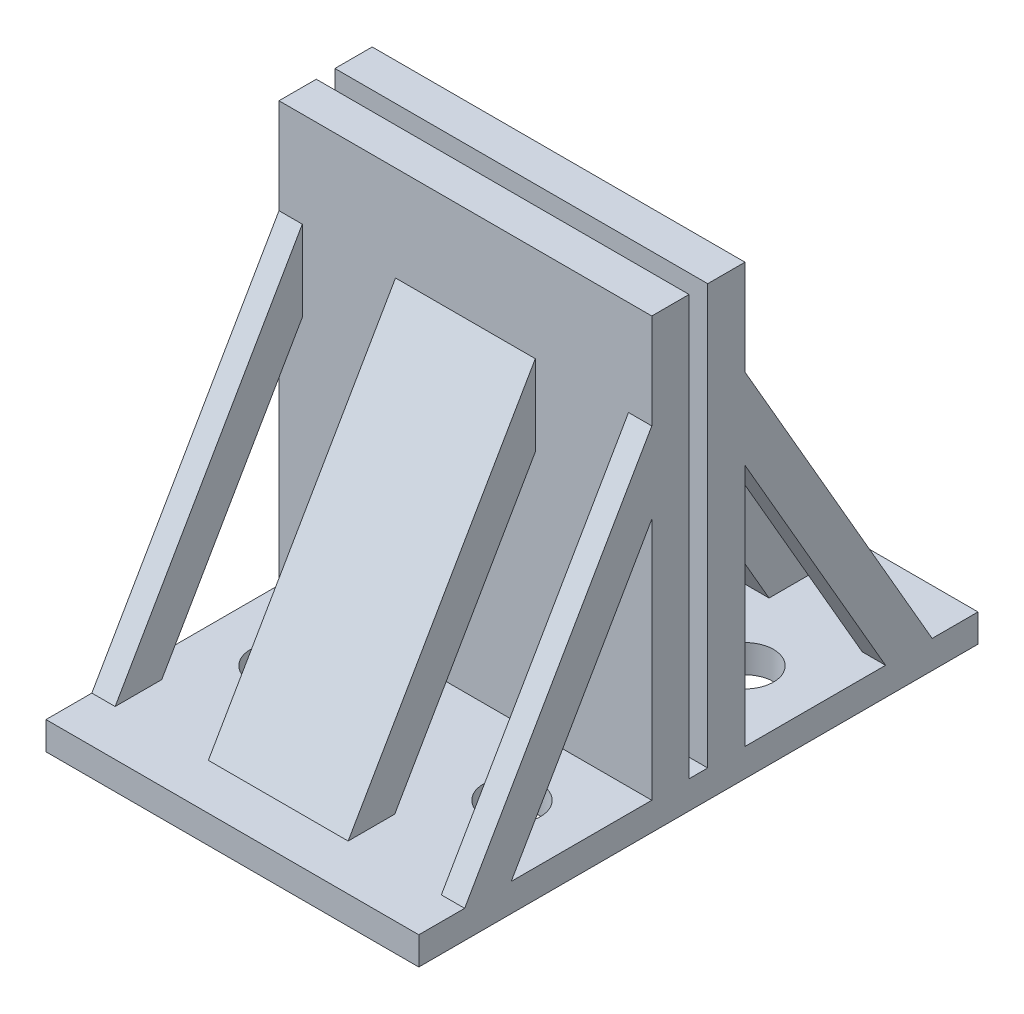
ISO-10303-21;
HEADER;
FILE_DESCRIPTION(('STEP AP214'),'2;1');
FILE_NAME('part.step','',(''),(''),'','','');
FILE_SCHEMA(('AUTOMOTIVE_DESIGN { 1 0 10303 214 1 1 1 1 }'));
ENDSEC;
DATA;
#1=APPLICATION_CONTEXT('core data for automotive mechanical design processes');
#2=APPLICATION_PROTOCOL_DEFINITION('international standard','automotive_design',2000,#1);
#3=PRODUCT_CONTEXT('',#1,'mechanical');
#4=PRODUCT('Part','Part','',(#3));
#5=PRODUCT_RELATED_PRODUCT_CATEGORY('part','',(#4));
#6=PRODUCT_DEFINITION_FORMATION('','',#4);
#7=PRODUCT_DEFINITION_CONTEXT('part definition',#1,'design');
#8=PRODUCT_DEFINITION('design','',#6,#7);
#9=PRODUCT_DEFINITION_SHAPE('','',#8);
#10=(LENGTH_UNIT() NAMED_UNIT(*) SI_UNIT(.MILLI.,.METRE.));
#11=(NAMED_UNIT(*) PLANE_ANGLE_UNIT() SI_UNIT($,.RADIAN.));
#12=(NAMED_UNIT(*) SI_UNIT($,.STERADIAN.) SOLID_ANGLE_UNIT());
#13=UNCERTAINTY_MEASURE_WITH_UNIT(LENGTH_MEASURE(1.E-05),#10,'distance_accuracy_value','');
#14=(GEOMETRIC_REPRESENTATION_CONTEXT(3) GLOBAL_UNCERTAINTY_ASSIGNED_CONTEXT((#13)) GLOBAL_UNIT_ASSIGNED_CONTEXT((#10,
#11,#12)) REPRESENTATION_CONTEXT('',''));
#15=CARTESIAN_POINT('',(0.,0.,0.));
#16=DIRECTION('',(0.,0.,1.));
#17=DIRECTION('',(1.,0.,0.));
#18=AXIS2_PLACEMENT_3D('',#15,#16,#17);
#19=CARTESIAN_POINT('',(20.,3.,25.0811714558439));
#20=DIRECTION('',(0.,-0.500000000000004,-0.866025403784437));
#21=DIRECTION('',(0.,0.866025403784437,-0.500000000000004));
#22=AXIS2_PLACEMENT_3D('',#19,#20,#21);
#23=PLANE('',#22);
#24=DIRECTION('',(0.,-0.866025403784437,0.500000000000004));
#25=VECTOR('',#24,1.);
#26=CARTESIAN_POINT('',(-17.5,3.,25.0811714558439));
#27=LINE('',#26,#25);
#28=CARTESIAN_POINT('',(-17.5,37.7816092370232,4.99999999999998));
#29=VERTEX_POINT('',#28);
#30=CARTESIAN_POINT('',(-17.5,3.,25.0811714558439));
#31=VERTEX_POINT('',#30);
#32=EDGE_CURVE('E289',#29,#31,#27,.T.);
#33=ORIENTED_EDGE('',*,*,#32,.F.);
#34=DIRECTION('',(-1.,0.,0.));
#35=VECTOR('',#34,1.);
#36=CARTESIAN_POINT('',(20.,37.7816092370231,5.));
#37=LINE('',#36,#35);
#38=CARTESIAN_POINT('',(-20.,37.7816092370231,5.));
#39=VERTEX_POINT('',#38);
#40=EDGE_CURVE('E296',#29,#39,#37,.T.);
#41=ORIENTED_EDGE('',*,*,#40,.T.);
#42=DIRECTION('',(0.,-0.866025403784436,0.500000000000004));
#43=VECTOR('',#42,1.);
#44=CARTESIAN_POINT('',(-20.,3.,25.0811714558439));
#45=LINE('',#44,#43);
#46=CARTESIAN_POINT('',(-20.,3.,25.0811714558439));
#47=VERTEX_POINT('',#46);
#48=EDGE_CURVE('E542',#39,#47,#45,.T.);
#49=ORIENTED_EDGE('',*,*,#48,.T.);
#50=DIRECTION('',(-1.,0.,0.));
#51=VECTOR('',#50,1.);
#52=CARTESIAN_POINT('',(20.,3.,25.0811714558439));
#53=LINE('',#52,#51);
#54=EDGE_CURVE('E293',#31,#47,#53,.T.);
#55=ORIENTED_EDGE('',*,*,#54,.F.);
#56=EDGE_LOOP('',(#33,#41,#49,#55));
#57=FACE_BOUND('',#56,.T.);
#58=ADVANCED_FACE('F39',(#57),#23,.F.);
#59=CARTESIAN_POINT('',(7.5,37.7816092370232,4.99999999999998));
#60=VERTEX_POINT('',#59);
#61=CARTESIAN_POINT('',(-7.5,37.7816092370231,5.));
#62=VERTEX_POINT('',#61);
#63=EDGE_CURVE('E287',#60,#62,#37,.T.);
#64=ORIENTED_EDGE('',*,*,#63,.T.);
#65=DIRECTION('',(0.,-0.866025403784437,0.500000000000004));
#66=VECTOR('',#65,1.);
#67=CARTESIAN_POINT('',(-7.5,3.,25.0811714558439));
#68=LINE('',#67,#66);
#69=CARTESIAN_POINT('',(-7.5,3.,25.0811714558439));
#70=VERTEX_POINT('',#69);
#71=EDGE_CURVE('E275',#62,#70,#68,.T.);
#72=ORIENTED_EDGE('',*,*,#71,.T.);
#73=CARTESIAN_POINT('',(7.5,3.,25.0811714558439));
#74=VERTEX_POINT('',#73);
#75=EDGE_CURVE('E285',#74,#70,#53,.T.);
#76=ORIENTED_EDGE('',*,*,#75,.F.);
#77=DIRECTION('',(0.,-0.866025403784437,0.500000000000004));
#78=VECTOR('',#77,1.);
#79=CARTESIAN_POINT('',(7.5,3.,25.0811714558439));
#80=LINE('',#79,#78);
#81=EDGE_CURVE('E570',#60,#74,#80,.T.);
#82=ORIENTED_EDGE('',*,*,#81,.F.);
#83=EDGE_LOOP('',(#64,#72,#76,#82));
#84=FACE_BOUND('',#83,.T.);
#85=ADVANCED_FACE('F283',(#84),#23,.F.);
#86=CARTESIAN_POINT('',(20.,29.1213551991788,5.));
#87=DIRECTION('',(0.,0.500000000000004,0.866025403784436));
#88=DIRECTION('',(0.,-0.866025403784436,0.500000000000004));
#89=AXIS2_PLACEMENT_3D('',#86,#87,#88);
#90=PLANE('',#89);
#91=DIRECTION('',(0.,0.866025403784436,-0.500000000000004));
#92=VECTOR('',#91,1.);
#93=CARTESIAN_POINT('',(-17.5,29.1213551991788,4.99999999999999));
#94=LINE('',#93,#92);
#95=CARTESIAN_POINT('',(-17.5,3.,20.0811714558439));
#96=VERTEX_POINT('',#95);
#97=CARTESIAN_POINT('',(-17.5,29.1213551991788,4.99999999999999));
#98=VERTEX_POINT('',#97);
#99=EDGE_CURVE('E47',#96,#98,#94,.T.);
#100=ORIENTED_EDGE('',*,*,#99,.F.);
#101=DIRECTION('',(-1.,0.,0.));
#102=VECTOR('',#101,1.);
#103=CARTESIAN_POINT('',(20.,3.,20.0811714558439));
#104=LINE('',#103,#102);
#105=CARTESIAN_POINT('',(-20.,3.,20.0811714558439));
#106=VERTEX_POINT('',#105);
#107=EDGE_CURVE('E461',#96,#106,#104,.T.);
#108=ORIENTED_EDGE('',*,*,#107,.T.);
#109=DIRECTION('',(0.,0.866025403784436,-0.500000000000004));
#110=VECTOR('',#109,1.);
#111=CARTESIAN_POINT('',(-20.,29.1213551991788,5.));
#112=LINE('',#111,#110);
#113=CARTESIAN_POINT('',(-20.,29.1213551991788,5.));
#114=VERTEX_POINT('',#113);
#115=EDGE_CURVE('E453',#106,#114,#112,.T.);
#116=ORIENTED_EDGE('',*,*,#115,.T.);
#117=DIRECTION('',(-1.,0.,0.));
#118=VECTOR('',#117,1.);
#119=CARTESIAN_POINT('',(20.,29.1213551991788,5.));
#120=LINE('',#119,#118);
#121=EDGE_CURVE('E446',#98,#114,#120,.T.);
#122=ORIENTED_EDGE('',*,*,#121,.F.);
#123=EDGE_LOOP('',(#100,#108,#116,#122));
#124=FACE_BOUND('',#123,.T.);
#125=ADVANCED_FACE('F451',(#124),#90,.F.);
#126=CARTESIAN_POINT('',(7.5,3.,20.0811714558439));
#127=VERTEX_POINT('',#126);
#128=CARTESIAN_POINT('',(-7.5,3.,20.0811714558439));
#129=VERTEX_POINT('',#128);
#130=EDGE_CURVE('E464',#127,#129,#104,.T.);
#131=ORIENTED_EDGE('',*,*,#130,.T.);
#132=DIRECTION('',(0.,0.866025403784436,-0.500000000000004));
#133=VECTOR('',#132,1.);
#134=CARTESIAN_POINT('',(-7.50000000000001,29.1213551991788,5.));
#135=LINE('',#134,#133);
#136=CARTESIAN_POINT('',(-7.5,29.1213551991788,5.));
#137=VERTEX_POINT('',#136);
#138=EDGE_CURVE('E11',#129,#137,#135,.T.);
#139=ORIENTED_EDGE('',*,*,#138,.T.);
#140=CARTESIAN_POINT('',(7.5,29.1213551991788,4.99999999999999));
#141=VERTEX_POINT('',#140);
#142=EDGE_CURVE('E454',#141,#137,#120,.T.);
#143=ORIENTED_EDGE('',*,*,#142,.F.);
#144=DIRECTION('',(0.,0.866025403784436,-0.500000000000004));
#145=VECTOR('',#144,1.);
#146=CARTESIAN_POINT('',(7.5,29.1213551991788,4.99999999999999));
#147=LINE('',#146,#145);
#148=EDGE_CURVE('E433',#127,#141,#147,.T.);
#149=ORIENTED_EDGE('',*,*,#148,.F.);
#150=EDGE_LOOP('',(#131,#139,#143,#149));
#151=FACE_BOUND('',#150,.T.);
#152=ADVANCED_FACE('F629',(#151),#90,.F.);
#153=CARTESIAN_POINT('',(20.,3.,-25.0811714558439));
#154=DIRECTION('',(0.,-0.500000000000004,0.866025403784436));
#155=DIRECTION('',(0.,-0.866025403784436,-0.500000000000004));
#156=AXIS2_PLACEMENT_3D('',#153,#154,#155);
#157=PLANE('',#156);
#158=DIRECTION('',(0.,-0.866025403784436,-0.500000000000004));
#159=VECTOR('',#158,1.);
#160=CARTESIAN_POINT('',(17.5,3.,-25.0811714558439));
#161=LINE('',#160,#159);
#162=CARTESIAN_POINT('',(17.5,37.7816092370232,-4.99999999999998));
#163=VERTEX_POINT('',#162);
#164=CARTESIAN_POINT('',(17.5,3.,-25.0811714558439));
#165=VERTEX_POINT('',#164);
#166=EDGE_CURVE('E564',#163,#165,#161,.T.);
#167=ORIENTED_EDGE('',*,*,#166,.F.);
#168=DIRECTION('',(-1.,0.,0.));
#169=VECTOR('',#168,1.);
#170=CARTESIAN_POINT('',(20.,37.7816092370231,-5.));
#171=LINE('',#170,#169);
#172=CARTESIAN_POINT('',(20.,37.7816092370231,-5.));
#173=VERTEX_POINT('',#172);
#174=EDGE_CURVE('E517',#173,#163,#171,.T.);
#175=ORIENTED_EDGE('',*,*,#174,.F.);
#176=DIRECTION('',(0.,0.866025403784436,0.500000000000004));
#177=VECTOR('',#176,1.);
#178=CARTESIAN_POINT('',(20.,3.,-25.0811714558439));
#179=LINE('',#178,#177);
#180=CARTESIAN_POINT('',(20.,3.,-25.0811714558439));
#181=VERTEX_POINT('',#180);
#182=EDGE_CURVE('E497',#181,#173,#179,.T.);
#183=ORIENTED_EDGE('',*,*,#182,.F.);
#184=DIRECTION('',(-1.,0.,0.));
#185=VECTOR('',#184,1.);
#186=CARTESIAN_POINT('',(20.,3.,-25.0811714558439));
#187=LINE('',#186,#185);
#188=EDGE_CURVE('E498',#181,#165,#187,.T.);
#189=ORIENTED_EDGE('',*,*,#188,.T.);
#190=EDGE_LOOP('',(#167,#175,#183,#189));
#191=FACE_BOUND('',#190,.T.);
#192=ADVANCED_FACE('F562',(#191),#157,.F.);
#193=CARTESIAN_POINT('',(7.5,37.7816092370232,-4.99999999999998));
#194=VERTEX_POINT('',#193);
#195=CARTESIAN_POINT('',(-7.5,37.7816092370231,-4.99999999999999));
#196=VERTEX_POINT('',#195);
#197=EDGE_CURVE('E523',#194,#196,#171,.T.);
#198=ORIENTED_EDGE('',*,*,#197,.F.);
#199=DIRECTION('',(0.,-0.866025403784436,-0.500000000000004));
#200=VECTOR('',#199,1.);
#201=CARTESIAN_POINT('',(7.5,3.,-25.0811714558439));
#202=LINE('',#201,#200);
#203=CARTESIAN_POINT('',(7.5,3.,-25.0811714558439));
#204=VERTEX_POINT('',#203);
#205=EDGE_CURVE('E567',#194,#204,#202,.T.);
#206=ORIENTED_EDGE('',*,*,#205,.T.);
#207=CARTESIAN_POINT('',(-7.5,3.,-25.0811714558439));
#208=VERTEX_POINT('',#207);
#209=EDGE_CURVE('E506',#204,#208,#187,.T.);
#210=ORIENTED_EDGE('',*,*,#209,.T.);
#211=DIRECTION('',(0.,-0.866025403784436,-0.500000000000004));
#212=VECTOR('',#211,1.);
#213=CARTESIAN_POINT('',(-7.5,3.,-25.0811714558439));
#214=LINE('',#213,#212);
#215=EDGE_CURVE('E669',#196,#208,#214,.T.);
#216=ORIENTED_EDGE('',*,*,#215,.F.);
#217=EDGE_LOOP('',(#198,#206,#210,#216));
#218=FACE_BOUND('',#217,.T.);
#219=ADVANCED_FACE('F667',(#218),#157,.F.);
#220=CARTESIAN_POINT('',(20.,29.1213551991788,-5.));
#221=DIRECTION('',(0.,0.500000000000004,-0.866025403784436));
#222=DIRECTION('',(0.,0.866025403784436,0.500000000000004));
#223=AXIS2_PLACEMENT_3D('',#220,#221,#222);
#224=PLANE('',#223);
#225=DIRECTION('',(0.,0.866025403784436,0.500000000000004));
#226=VECTOR('',#225,1.);
#227=CARTESIAN_POINT('',(17.5,29.1213551991788,-5.));
#228=LINE('',#227,#226);
#229=CARTESIAN_POINT('',(17.5,3.,-20.0811714558439));
#230=VERTEX_POINT('',#229);
#231=CARTESIAN_POINT('',(17.5,29.1213551991788,-4.99999999999999));
#232=VERTEX_POINT('',#231);
#233=EDGE_CURVE('E428',#230,#232,#228,.T.);
#234=ORIENTED_EDGE('',*,*,#233,.F.);
#235=DIRECTION('',(-1.,0.,0.));
#236=VECTOR('',#235,1.);
#237=CARTESIAN_POINT('',(20.,3.,-20.0811714558439));
#238=LINE('',#237,#236);
#239=CARTESIAN_POINT('',(20.,3.,-20.0811714558439));
#240=VERTEX_POINT('',#239);
#241=EDGE_CURVE('E491',#240,#230,#238,.T.);
#242=ORIENTED_EDGE('',*,*,#241,.F.);
#243=DIRECTION('',(0.,-0.866025403784436,-0.500000000000004));
#244=VECTOR('',#243,1.);
#245=CARTESIAN_POINT('',(20.,29.1213551991788,-5.));
#246=LINE('',#245,#244);
#247=CARTESIAN_POINT('',(20.,29.1213551991788,-5.));
#248=VERTEX_POINT('',#247);
#249=EDGE_CURVE('E493',#248,#240,#246,.T.);
#250=ORIENTED_EDGE('',*,*,#249,.F.);
#251=DIRECTION('',(-1.,0.,0.));
#252=VECTOR('',#251,1.);
#253=CARTESIAN_POINT('',(20.,29.1213551991788,-5.));
#254=LINE('',#253,#252);
#255=EDGE_CURVE('E510',#248,#232,#254,.T.);
#256=ORIENTED_EDGE('',*,*,#255,.T.);
#257=EDGE_LOOP('',(#234,#242,#250,#256));
#258=FACE_BOUND('',#257,.T.);
#259=ADVANCED_FACE('F501',(#258),#224,.F.);
#260=CARTESIAN_POINT('',(7.5,3.,-20.0811714558439));
#261=VERTEX_POINT('',#260);
#262=CARTESIAN_POINT('',(-7.5,3.,-20.0811714558439));
#263=VERTEX_POINT('',#262);
#264=EDGE_CURVE('E503',#261,#263,#238,.T.);
#265=ORIENTED_EDGE('',*,*,#264,.F.);
#266=DIRECTION('',(0.,0.866025403784436,0.500000000000004));
#267=VECTOR('',#266,1.);
#268=CARTESIAN_POINT('',(7.5,29.1213551991788,-4.99999999999999));
#269=LINE('',#268,#267);
#270=CARTESIAN_POINT('',(7.5,29.1213551991788,-5.));
#271=VERTEX_POINT('',#270);
#272=EDGE_CURVE('E425',#261,#271,#269,.T.);
#273=ORIENTED_EDGE('',*,*,#272,.T.);
#274=CARTESIAN_POINT('',(-7.5,29.1213551991788,-5.));
#275=VERTEX_POINT('',#274);
#276=EDGE_CURVE('E513',#271,#275,#254,.T.);
#277=ORIENTED_EDGE('',*,*,#276,.T.);
#278=DIRECTION('',(0.,0.866025403784436,0.500000000000004));
#279=VECTOR('',#278,1.);
#280=CARTESIAN_POINT('',(-7.5,29.1213551991788,-5.));
#281=LINE('',#280,#279);
#282=EDGE_CURVE('E420',#263,#275,#281,.T.);
#283=ORIENTED_EDGE('',*,*,#282,.F.);
#284=EDGE_LOOP('',(#265,#273,#277,#283));
#285=FACE_BOUND('',#284,.T.);
#286=ADVANCED_FACE('F721',(#285),#224,.F.);
#287=CARTESIAN_POINT('',(0.,3.,0.));
#288=DIRECTION('',(0.,-1.,0.));
#289=DIRECTION('',(0.,0.,-1.));
#290=AXIS2_PLACEMENT_3D('',#287,#288,#289);
#291=PLANE('',#290);
#292=DIRECTION('',(0.,0.,-1.));
#293=VECTOR('',#292,1.);
#294=CARTESIAN_POINT('',(7.5,3.,0.));
#295=LINE('',#294,#293);
#296=EDGE_CURVE('E671',#261,#204,#295,.T.);
#297=ORIENTED_EDGE('',*,*,#296,.F.);
#298=ORIENTED_EDGE('',*,*,#264,.T.);
#299=DIRECTION('',(0.,0.,-1.));
#300=VECTOR('',#299,1.);
#301=CARTESIAN_POINT('',(-7.5,3.,0.));
#302=LINE('',#301,#300);
#303=EDGE_CURVE('E652',#263,#208,#302,.T.);
#304=ORIENTED_EDGE('',*,*,#303,.T.);
#305=ORIENTED_EDGE('',*,*,#209,.F.);
#306=EDGE_LOOP('',(#297,#298,#304,#305));
#307=FACE_BOUND('',#306,.T.);
#308=DIRECTION('',(0.,0.,1.));
#309=VECTOR('',#308,1.);
#310=CARTESIAN_POINT('',(-20.,3.,30.));
#311=LINE('',#310,#309);
#312=CARTESIAN_POINT('',(-20.,3.,-20.0811714558439));
#313=VERTEX_POINT('',#312);
#314=CARTESIAN_POINT('',(-20.,3.,-5.));
#315=VERTEX_POINT('',#314);
#316=EDGE_CURVE('E397',#313,#315,#311,.T.);
#317=ORIENTED_EDGE('',*,*,#316,.T.);
#318=DIRECTION('',(-1.,0.,0.));
#319=VECTOR('',#318,1.);
#320=CARTESIAN_POINT('',(-20.,3.,-5.));
#321=LINE('',#320,#319);
#322=CARTESIAN_POINT('',(20.,3.,-5.));
#323=VERTEX_POINT('',#322);
#324=EDGE_CURVE('E325',#323,#315,#321,.T.);
#325=ORIENTED_EDGE('',*,*,#324,.F.);
#326=DIRECTION('',(0.,0.,-1.));
#327=VECTOR('',#326,1.);
#328=CARTESIAN_POINT('',(20.,3.,30.));
#329=LINE('',#328,#327);
#330=EDGE_CURVE('E390',#323,#240,#329,.T.);
#331=ORIENTED_EDGE('',*,*,#330,.T.);
#332=ORIENTED_EDGE('',*,*,#241,.T.);
#333=DIRECTION('',(0.,0.,-1.));
#334=VECTOR('',#333,1.);
#335=CARTESIAN_POINT('',(17.5,3.,0.));
#336=LINE('',#335,#334);
#337=EDGE_CURVE('E692',#230,#165,#336,.T.);
#338=ORIENTED_EDGE('',*,*,#337,.T.);
#339=ORIENTED_EDGE('',*,*,#188,.F.);
#340=CARTESIAN_POINT('',(20.,3.,-30.));
#341=VERTEX_POINT('',#340);
#342=EDGE_CURVE('E389',#181,#341,#329,.T.);
#343=ORIENTED_EDGE('',*,*,#342,.T.);
#344=DIRECTION('',(-1.,0.,0.));
#345=VECTOR('',#344,1.);
#346=CARTESIAN_POINT('',(-20.,3.,-30.));
#347=LINE('',#346,#345);
#348=CARTESIAN_POINT('',(-20.,3.,-30.));
#349=VERTEX_POINT('',#348);
#350=EDGE_CURVE('E387',#341,#349,#347,.T.);
#351=ORIENTED_EDGE('',*,*,#350,.T.);
#352=CARTESIAN_POINT('',(-20.,3.,-25.0811714558439));
#353=VERTEX_POINT('',#352);
#354=EDGE_CURVE('E393',#349,#353,#311,.T.);
#355=ORIENTED_EDGE('',*,*,#354,.T.);
#356=CARTESIAN_POINT('',(-17.5,3.,-25.0811714558439));
#357=VERTEX_POINT('',#356);
#358=EDGE_CURVE('E502',#357,#353,#187,.T.);
#359=ORIENTED_EDGE('',*,*,#358,.F.);
#360=DIRECTION('',(0.,0.,-1.));
#361=VECTOR('',#360,1.);
#362=CARTESIAN_POINT('',(-17.5,3.,0.));
#363=LINE('',#362,#361);
#364=CARTESIAN_POINT('',(-17.5,3.,-20.0811714558439));
#365=VERTEX_POINT('',#364);
#366=EDGE_CURVE('E649',#365,#357,#363,.T.);
#367=ORIENTED_EDGE('',*,*,#366,.F.);
#368=EDGE_CURVE('E505',#365,#313,#238,.T.);
#369=ORIENTED_EDGE('',*,*,#368,.T.);
#370=EDGE_LOOP('',(#317,#325,#331,#332,#338,#339,#343,#351,#355,#359,#367,#369));
#371=FACE_BOUND('',#370,.T.);
#372=CARTESIAN_POINT('',(-12.5,3.,-12.5));
#373=DIRECTION('',(0.,1.,0.));
#374=DIRECTION('',(0.,0.,1.));
#375=AXIS2_PLACEMENT_3D('',#372,#373,#374);
#376=CIRCLE('',#375,3.05);
#377=CARTESIAN_POINT('',(-12.5,3.,-9.45));
#378=VERTEX_POINT('',#377);
#379=EDGE_CURVE('E379',#378,#378,#376,.T.);
#380=ORIENTED_EDGE('',*,*,#379,.F.);
#381=EDGE_LOOP('',(#380));
#382=FACE_BOUND('',#381,.T.);
#383=CARTESIAN_POINT('',(12.5,3.,-12.5));
#384=DIRECTION('',(0.,1.,0.));
#385=DIRECTION('',(0.,0.,-1.));
#386=AXIS2_PLACEMENT_3D('',#383,#384,#385);
#387=CIRCLE('',#386,3.05);
#388=CARTESIAN_POINT('',(12.5,3.,-15.55));
#389=VERTEX_POINT('',#388);
#390=EDGE_CURVE('E373',#389,#389,#387,.T.);
#391=ORIENTED_EDGE('',*,*,#390,.F.);
#392=EDGE_LOOP('',(#391));
#393=FACE_BOUND('',#392,.T.);
#394=ADVANCED_FACE('F488',(#307,#371,#382,#393),#291,.F.);
#395=CARTESIAN_POINT('',(-20.,48.,-5.));
#396=DIRECTION('',(0.,0.,1.));
#397=DIRECTION('',(1.,0.,0.));
#398=AXIS2_PLACEMENT_3D('',#395,#396,#397);
#399=PLANE('',#398);
#400=DIRECTION('',(0.,-1.,0.));
#401=VECTOR('',#400,1.);
#402=CARTESIAN_POINT('',(7.5,48.,-5.));
#403=LINE('',#402,#401);
#404=EDGE_CURVE('E689',#194,#271,#403,.T.);
#405=ORIENTED_EDGE('',*,*,#404,.F.);
#406=ORIENTED_EDGE('',*,*,#197,.T.);
#407=DIRECTION('',(0.,-1.,0.));
#408=VECTOR('',#407,1.);
#409=CARTESIAN_POINT('',(-7.5,48.,-5.));
#410=LINE('',#409,#408);
#411=EDGE_CURVE('E676',#196,#275,#410,.T.);
#412=ORIENTED_EDGE('',*,*,#411,.T.);
#413=ORIENTED_EDGE('',*,*,#276,.F.);
#414=EDGE_LOOP('',(#405,#406,#412,#413));
#415=FACE_BOUND('',#414,.T.);
#416=CARTESIAN_POINT('',(-17.5,29.1213551991788,-5.));
#417=VERTEX_POINT('',#416);
#418=CARTESIAN_POINT('',(-20.,29.1213551991788,-5.));
#419=VERTEX_POINT('',#418);
#420=EDGE_CURVE('E514',#417,#419,#254,.T.);
#421=ORIENTED_EDGE('',*,*,#420,.F.);
#422=DIRECTION('',(0.,-1.,0.));
#423=VECTOR('',#422,1.);
#424=CARTESIAN_POINT('',(-17.5,48.,-5.));
#425=LINE('',#424,#423);
#426=CARTESIAN_POINT('',(-17.5,37.7816092370231,-5.));
#427=VERTEX_POINT('',#426);
#428=EDGE_CURVE('E278',#427,#417,#425,.T.);
#429=ORIENTED_EDGE('',*,*,#428,.F.);
#430=CARTESIAN_POINT('',(-20.,37.7816092370231,-5.));
#431=VERTEX_POINT('',#430);
#432=EDGE_CURVE('E288',#427,#431,#171,.T.);
#433=ORIENTED_EDGE('',*,*,#432,.T.);
#434=DIRECTION('',(0.,-1.,0.));
#435=VECTOR('',#434,1.);
#436=CARTESIAN_POINT('',(-20.,48.,-5.));
#437=LINE('',#436,#435);
#438=CARTESIAN_POINT('',(-20.,48.,-5.));
#439=VERTEX_POINT('',#438);
#440=EDGE_CURVE('E353',#439,#431,#437,.T.);
#441=ORIENTED_EDGE('',*,*,#440,.F.);
#442=DIRECTION('',(-1.,0.,0.));
#443=VECTOR('',#442,1.);
#444=CARTESIAN_POINT('',(-20.,48.,-5.));
#445=LINE('',#444,#443);
#446=CARTESIAN_POINT('',(20.,48.,-5.));
#447=VERTEX_POINT('',#446);
#448=EDGE_CURVE('E336',#447,#439,#445,.T.);
#449=ORIENTED_EDGE('',*,*,#448,.F.);
#450=DIRECTION('',(0.,-1.,0.));
#451=VECTOR('',#450,1.);
#452=CARTESIAN_POINT('',(20.,48.,-5.));
#453=LINE('',#452,#451);
#454=EDGE_CURVE('E357',#447,#173,#453,.T.);
#455=ORIENTED_EDGE('',*,*,#454,.T.);
#456=ORIENTED_EDGE('',*,*,#174,.T.);
#457=DIRECTION('',(0.,-1.,0.));
#458=VECTOR('',#457,1.);
#459=CARTESIAN_POINT('',(17.5,48.,-5.));
#460=LINE('',#459,#458);
#461=EDGE_CURVE('E653',#163,#232,#460,.T.);
#462=ORIENTED_EDGE('',*,*,#461,.T.);
#463=ORIENTED_EDGE('',*,*,#255,.F.);
#464=EDGE_CURVE('E356',#248,#323,#453,.T.);
#465=ORIENTED_EDGE('',*,*,#464,.T.);
#466=ORIENTED_EDGE('',*,*,#324,.T.);
#467=EDGE_CURVE('E352',#419,#315,#437,.T.);
#468=ORIENTED_EDGE('',*,*,#467,.F.);
#469=EDGE_LOOP('',(#421,#429,#433,#441,#449,#455,#456,#462,#463,#465,#466,#468));
#470=FACE_BOUND('',#469,.T.);
#471=ADVANCED_FACE('F532',(#415,#470),#399,.F.);
#472=DIRECTION('',(0.,0.,1.));
#473=VECTOR('',#472,1.);
#474=CARTESIAN_POINT('',(-7.5,3.,0.));
#475=LINE('',#474,#473);
#476=EDGE_CURVE('E272',#129,#70,#475,.T.);
#477=ORIENTED_EDGE('',*,*,#476,.F.);
#478=ORIENTED_EDGE('',*,*,#130,.F.);
#479=DIRECTION('',(0.,0.,1.));
#480=VECTOR('',#479,1.);
#481=CARTESIAN_POINT('',(7.5,3.,0.));
#482=LINE('',#481,#480);
#483=EDGE_CURVE('E62',#127,#74,#482,.T.);
#484=ORIENTED_EDGE('',*,*,#483,.T.);
#485=ORIENTED_EDGE('',*,*,#75,.T.);
#486=EDGE_LOOP('',(#477,#478,#484,#485));
#487=FACE_BOUND('',#486,.T.);
#488=CARTESIAN_POINT('',(20.,3.,20.0811714558439));
#489=VERTEX_POINT('',#488);
#490=CARTESIAN_POINT('',(20.,3.,5.));
#491=VERTEX_POINT('',#490);
#492=EDGE_CURVE('E388',#489,#491,#329,.T.);
#493=ORIENTED_EDGE('',*,*,#492,.T.);
#494=DIRECTION('',(1.,0.,0.));
#495=VECTOR('',#494,1.);
#496=CARTESIAN_POINT('',(-20.,3.,5.));
#497=LINE('',#496,#495);
#498=CARTESIAN_POINT('',(-20.,3.,5.));
#499=VERTEX_POINT('',#498);
#500=EDGE_CURVE('E322',#499,#491,#497,.T.);
#501=ORIENTED_EDGE('',*,*,#500,.F.);
#502=EDGE_CURVE('E586',#499,#106,#311,.T.);
#503=ORIENTED_EDGE('',*,*,#502,.T.);
#504=ORIENTED_EDGE('',*,*,#107,.F.);
#505=DIRECTION('',(0.,0.,1.));
#506=VECTOR('',#505,1.);
#507=CARTESIAN_POINT('',(-17.5,3.,0.));
#508=LINE('',#507,#506);
#509=EDGE_CURVE('E54',#96,#31,#508,.T.);
#510=ORIENTED_EDGE('',*,*,#509,.T.);
#511=ORIENTED_EDGE('',*,*,#54,.T.);
#512=CARTESIAN_POINT('',(-20.,3.,30.));
#513=VERTEX_POINT('',#512);
#514=EDGE_CURVE('E392',#47,#513,#311,.T.);
#515=ORIENTED_EDGE('',*,*,#514,.T.);
#516=DIRECTION('',(1.,0.,0.));
#517=VECTOR('',#516,1.);
#518=CARTESIAN_POINT('',(-20.,3.,30.));
#519=LINE('',#518,#517);
#520=CARTESIAN_POINT('',(20.,3.,30.));
#521=VERTEX_POINT('',#520);
#522=EDGE_CURVE('E396',#513,#521,#519,.T.);
#523=ORIENTED_EDGE('',*,*,#522,.T.);
#524=CARTESIAN_POINT('',(20.,3.,25.0811714558439));
#525=VERTEX_POINT('',#524);
#526=EDGE_CURVE('E385',#521,#525,#329,.T.);
#527=ORIENTED_EDGE('',*,*,#526,.T.);
#528=CARTESIAN_POINT('',(17.5,3.,25.0811714558439));
#529=VERTEX_POINT('',#528);
#530=EDGE_CURVE('E292',#525,#529,#53,.T.);
#531=ORIENTED_EDGE('',*,*,#530,.T.);
#532=DIRECTION('',(0.,0.,1.));
#533=VECTOR('',#532,1.);
#534=CARTESIAN_POINT('',(17.5,3.,0.));
#535=LINE('',#534,#533);
#536=CARTESIAN_POINT('',(17.5,3.,20.0811714558439));
#537=VERTEX_POINT('',#536);
#538=EDGE_CURVE('E476',#537,#529,#535,.T.);
#539=ORIENTED_EDGE('',*,*,#538,.F.);
#540=EDGE_CURVE('E297',#489,#537,#104,.T.);
#541=ORIENTED_EDGE('',*,*,#540,.F.);
#542=EDGE_LOOP('',(#493,#501,#503,#504,#510,#511,#515,#523,#527,#531,#539,#541));
#543=FACE_BOUND('',#542,.T.);
#544=CARTESIAN_POINT('',(12.5,3.,12.5));
#545=DIRECTION('',(0.,1.,0.));
#546=DIRECTION('',(0.,0.,1.));
#547=AXIS2_PLACEMENT_3D('',#544,#545,#546);
#548=CIRCLE('',#547,3.05);
#549=CARTESIAN_POINT('',(12.5,3.,15.55));
#550=VERTEX_POINT('',#549);
#551=EDGE_CURVE('E367',#550,#550,#548,.T.);
#552=ORIENTED_EDGE('',*,*,#551,.F.);
#553=EDGE_LOOP('',(#552));
#554=FACE_BOUND('',#553,.T.);
#555=CARTESIAN_POINT('',(-12.5,3.,12.5));
#556=DIRECTION('',(0.,1.,0.));
#557=DIRECTION('',(0.,0.,-1.));
#558=AXIS2_PLACEMENT_3D('',#555,#556,#557);
#559=CIRCLE('',#558,3.05);
#560=CARTESIAN_POINT('',(-12.5,3.,9.45));
#561=VERTEX_POINT('',#560);
#562=EDGE_CURVE('E361',#561,#561,#559,.T.);
#563=ORIENTED_EDGE('',*,*,#562,.F.);
#564=EDGE_LOOP('',(#563));
#565=FACE_BOUND('',#564,.T.);
#566=ADVANCED_FACE('F291',(#487,#543,#554,#565),#291,.F.);
#567=CARTESIAN_POINT('',(-20.,48.,5.));
#568=DIRECTION('',(0.,0.,-1.));
#569=DIRECTION('',(-1.,0.,0.));
#570=AXIS2_PLACEMENT_3D('',#567,#568,#569);
#571=PLANE('',#570);
#572=DIRECTION('',(0.,-1.,0.));
#573=VECTOR('',#572,1.);
#574=CARTESIAN_POINT('',(-7.5,48.,5.));
#575=LINE('',#574,#573);
#576=EDGE_CURVE('E448',#62,#137,#575,.T.);
#577=ORIENTED_EDGE('',*,*,#576,.F.);
#578=ORIENTED_EDGE('',*,*,#63,.F.);
#579=DIRECTION('',(0.,-1.,0.));
#580=VECTOR('',#579,1.);
#581=CARTESIAN_POINT('',(7.5,48.,5.));
#582=LINE('',#581,#580);
#583=EDGE_CURVE('E680',#60,#141,#582,.T.);
#584=ORIENTED_EDGE('',*,*,#583,.T.);
#585=ORIENTED_EDGE('',*,*,#142,.T.);
#586=EDGE_LOOP('',(#577,#578,#584,#585));
#587=FACE_BOUND('',#586,.T.);
#588=CARTESIAN_POINT('',(20.,29.1213551991788,5.));
#589=VERTEX_POINT('',#588);
#590=CARTESIAN_POINT('',(17.5,29.1213551991788,4.99999999999999));
#591=VERTEX_POINT('',#590);
#592=EDGE_CURVE('E456',#589,#591,#120,.T.);
#593=ORIENTED_EDGE('',*,*,#592,.T.);
#594=DIRECTION('',(0.,-1.,0.));
#595=VECTOR('',#594,1.);
#596=CARTESIAN_POINT('',(17.5,48.,5.));
#597=LINE('',#596,#595);
#598=CARTESIAN_POINT('',(17.5,37.7816092370232,4.99999999999998));
#599=VERTEX_POINT('',#598);
#600=EDGE_CURVE('E634',#599,#591,#597,.T.);
#601=ORIENTED_EDGE('',*,*,#600,.F.);
#602=CARTESIAN_POINT('',(20.,37.7816092370231,5.));
#603=VERTEX_POINT('',#602);
#604=EDGE_CURVE('E301',#603,#599,#37,.T.);
#605=ORIENTED_EDGE('',*,*,#604,.F.);
#606=DIRECTION('',(0.,-1.,0.));
#607=VECTOR('',#606,1.);
#608=CARTESIAN_POINT('',(20.,48.,5.));
#609=LINE('',#608,#607);
#610=CARTESIAN_POINT('',(20.,48.,5.));
#611=VERTEX_POINT('',#610);
#612=EDGE_CURVE('E309',#611,#603,#609,.T.);
#613=ORIENTED_EDGE('',*,*,#612,.F.);
#614=DIRECTION('',(1.,0.,0.));
#615=VECTOR('',#614,1.);
#616=CARTESIAN_POINT('',(-20.,48.,5.));
#617=LINE('',#616,#615);
#618=CARTESIAN_POINT('',(-20.,48.,5.));
#619=VERTEX_POINT('',#618);
#620=EDGE_CURVE('E329',#619,#611,#617,.T.);
#621=ORIENTED_EDGE('',*,*,#620,.F.);
#622=DIRECTION('',(0.,-1.,0.));
#623=VECTOR('',#622,1.);
#624=CARTESIAN_POINT('',(-20.,48.,5.));
#625=LINE('',#624,#623);
#626=EDGE_CURVE('E305',#619,#39,#625,.T.);
#627=ORIENTED_EDGE('',*,*,#626,.T.);
#628=ORIENTED_EDGE('',*,*,#40,.F.);
#629=DIRECTION('',(0.,-1.,0.));
#630=VECTOR('',#629,1.);
#631=CARTESIAN_POINT('',(-17.5,48.,5.));
#632=LINE('',#631,#630);
#633=EDGE_CURVE('E438',#29,#98,#632,.T.);
#634=ORIENTED_EDGE('',*,*,#633,.T.);
#635=ORIENTED_EDGE('',*,*,#121,.T.);
#636=EDGE_CURVE('E304',#114,#499,#625,.T.);
#637=ORIENTED_EDGE('',*,*,#636,.T.);
#638=ORIENTED_EDGE('',*,*,#500,.T.);
#639=EDGE_CURVE('E308',#589,#491,#609,.T.);
#640=ORIENTED_EDGE('',*,*,#639,.F.);
#641=EDGE_LOOP('',(#593,#601,#605,#613,#621,#627,#628,#634,#635,#637,#638,#640));
#642=FACE_BOUND('',#641,.T.);
#643=ADVANCED_FACE('F445',(#587,#642),#571,.F.);
#644=DIRECTION('',(-1.,0.,0.));
#645=VECTOR('',#644,1.);
#646=CARTESIAN_POINT('',(-20.,3.,1.));
#647=LINE('',#646,#645);
#648=CARTESIAN_POINT('',(20.,3.,1.));
#649=VERTEX_POINT('',#648);
#650=CARTESIAN_POINT('',(-20.,3.,1.));
#651=VERTEX_POINT('',#650);
#652=EDGE_CURVE('E319',#649,#651,#647,.T.);
#653=ORIENTED_EDGE('',*,*,#652,.F.);
#654=CARTESIAN_POINT('',(20.,3.,-1.));
#655=VERTEX_POINT('',#654);
#656=EDGE_CURVE('E479',#649,#655,#329,.T.);
#657=ORIENTED_EDGE('',*,*,#656,.T.);
#658=DIRECTION('',(1.,0.,0.));
#659=VECTOR('',#658,1.);
#660=CARTESIAN_POINT('',(-20.,3.,-1.));
#661=LINE('',#660,#659);
#662=CARTESIAN_POINT('',(-20.,3.,-1.));
#663=VERTEX_POINT('',#662);
#664=EDGE_CURVE('E337',#663,#655,#661,.T.);
#665=ORIENTED_EDGE('',*,*,#664,.F.);
#666=EDGE_CURVE('E398',#663,#651,#311,.T.);
#667=ORIENTED_EDGE('',*,*,#666,.T.);
#668=EDGE_LOOP('',(#653,#657,#665,#667));
#669=FACE_BOUND('',#668,.T.);
#670=ADVANCED_FACE('F589',(#669),#291,.F.);
#671=CARTESIAN_POINT('',(0.,0.,0.));
#672=DIRECTION('',(0.,-1.,0.));
#673=DIRECTION('',(0.,0.,-1.));
#674=AXIS2_PLACEMENT_3D('',#671,#672,#673);
#675=PLANE('',#674);
#676=CARTESIAN_POINT('',(12.5,0.,12.5));
#677=DIRECTION('',(0.,1.,0.));
#678=DIRECTION('',(0.,0.,1.));
#679=AXIS2_PLACEMENT_3D('',#676,#677,#678);
#680=CIRCLE('',#679,3.05);
#681=CARTESIAN_POINT('',(12.5,0.,15.55));
#682=VERTEX_POINT('',#681);
#683=EDGE_CURVE('E364',#682,#682,#680,.T.);
#684=ORIENTED_EDGE('',*,*,#683,.T.);
#685=EDGE_LOOP('',(#684));
#686=FACE_BOUND('',#685,.T.);
#687=CARTESIAN_POINT('',(-12.5,0.,-12.5));
#688=DIRECTION('',(0.,1.,0.));
#689=DIRECTION('',(0.,0.,1.));
#690=AXIS2_PLACEMENT_3D('',#687,#688,#689);
#691=CIRCLE('',#690,3.05);
#692=CARTESIAN_POINT('',(-12.5,0.,-9.45));
#693=VERTEX_POINT('',#692);
#694=EDGE_CURVE('E376',#693,#693,#691,.T.);
#695=ORIENTED_EDGE('',*,*,#694,.T.);
#696=EDGE_LOOP('',(#695));
#697=FACE_BOUND('',#696,.T.);
#698=DIRECTION('',(0.,0.,-1.));
#699=VECTOR('',#698,1.);
#700=CARTESIAN_POINT('',(20.,0.,30.));
#701=LINE('',#700,#699);
#702=CARTESIAN_POINT('',(20.,0.,30.));
#703=VERTEX_POINT('',#702);
#704=CARTESIAN_POINT('',(20.,0.,-30.));
#705=VERTEX_POINT('',#704);
#706=EDGE_CURVE('E382',#703,#705,#701,.T.);
#707=ORIENTED_EDGE('',*,*,#706,.F.);
#708=DIRECTION('',(1.,0.,0.));
#709=VECTOR('',#708,1.);
#710=CARTESIAN_POINT('',(-20.,0.,30.));
#711=LINE('',#710,#709);
#712=CARTESIAN_POINT('',(-20.,0.,30.));
#713=VERTEX_POINT('',#712);
#714=EDGE_CURVE('E407',#713,#703,#711,.T.);
#715=ORIENTED_EDGE('',*,*,#714,.F.);
#716=DIRECTION('',(0.,0.,1.));
#717=VECTOR('',#716,1.);
#718=CARTESIAN_POINT('',(-20.,0.,30.));
#719=LINE('',#718,#717);
#720=CARTESIAN_POINT('',(-20.,0.,-30.));
#721=VERTEX_POINT('',#720);
#722=EDGE_CURVE('E405',#721,#713,#719,.T.);
#723=ORIENTED_EDGE('',*,*,#722,.F.);
#724=DIRECTION('',(-1.,0.,0.));
#725=VECTOR('',#724,1.);
#726=CARTESIAN_POINT('',(-20.,0.,-30.));
#727=LINE('',#726,#725);
#728=EDGE_CURVE('E403',#705,#721,#727,.T.);
#729=ORIENTED_EDGE('',*,*,#728,.F.);
#730=EDGE_LOOP('',(#707,#715,#723,#729));
#731=FACE_BOUND('',#730,.T.);
#732=CARTESIAN_POINT('',(12.5,0.,-12.5));
#733=DIRECTION('',(0.,1.,0.));
#734=DIRECTION('',(0.,0.,-1.));
#735=AXIS2_PLACEMENT_3D('',#732,#733,#734);
#736=CIRCLE('',#735,3.05);
#737=CARTESIAN_POINT('',(12.5,0.,-15.55));
#738=VERTEX_POINT('',#737);
#739=EDGE_CURVE('E370',#738,#738,#736,.T.);
#740=ORIENTED_EDGE('',*,*,#739,.T.);
#741=EDGE_LOOP('',(#740));
#742=FACE_BOUND('',#741,.T.);
#743=CARTESIAN_POINT('',(-12.5,0.,12.5));
#744=DIRECTION('',(0.,1.,0.));
#745=DIRECTION('',(0.,0.,-1.));
#746=AXIS2_PLACEMENT_3D('',#743,#744,#745);
#747=CIRCLE('',#746,3.05);
#748=CARTESIAN_POINT('',(-12.5,0.,9.45));
#749=VERTEX_POINT('',#748);
#750=EDGE_CURVE('E360',#749,#749,#747,.T.);
#751=ORIENTED_EDGE('',*,*,#750,.T.);
#752=EDGE_LOOP('',(#751));
#753=FACE_BOUND('',#752,.T.);
#754=ADVANCED_FACE('F643',(#686,#697,#731,#742,#753),#675,.T.);
#755=CARTESIAN_POINT('',(20.,3.,30.));
#756=DIRECTION('',(-1.,0.,0.));
#757=DIRECTION('',(0.,0.,1.));
#758=AXIS2_PLACEMENT_3D('',#755,#756,#757);
#759=PLANE('',#758);
#760=ORIENTED_EDGE('',*,*,#342,.F.);
#761=ORIENTED_EDGE('',*,*,#182,.T.);
#762=ORIENTED_EDGE('',*,*,#454,.F.);
#763=DIRECTION('',(0.,0.,-1.));
#764=VECTOR('',#763,1.);
#765=CARTESIAN_POINT('',(20.,48.,-1.));
#766=LINE('',#765,#764);
#767=CARTESIAN_POINT('',(20.,48.,-1.));
#768=VERTEX_POINT('',#767);
#769=EDGE_CURVE('E333',#768,#447,#766,.T.);
#770=ORIENTED_EDGE('',*,*,#769,.F.);
#771=DIRECTION('',(0.,-1.,0.));
#772=VECTOR('',#771,1.);
#773=CARTESIAN_POINT('',(20.,48.,-1.));
#774=LINE('',#773,#772);
#775=EDGE_CURVE('E343',#768,#655,#774,.T.);
#776=ORIENTED_EDGE('',*,*,#775,.T.);
#777=ORIENTED_EDGE('',*,*,#656,.F.);
#778=DIRECTION('',(0.,-1.,0.));
#779=VECTOR('',#778,1.);
#780=CARTESIAN_POINT('',(20.,48.,1.));
#781=LINE('',#780,#779);
#782=CARTESIAN_POINT('',(20.,48.,1.));
#783=VERTEX_POINT('',#782);
#784=EDGE_CURVE('E312',#783,#649,#781,.T.);
#785=ORIENTED_EDGE('',*,*,#784,.F.);
#786=DIRECTION('',(0.,0.,-1.));
#787=VECTOR('',#786,1.);
#788=CARTESIAN_POINT('',(20.,48.,1.));
#789=LINE('',#788,#787);
#790=EDGE_CURVE('E327',#611,#783,#789,.T.);
#791=ORIENTED_EDGE('',*,*,#790,.F.);
#792=ORIENTED_EDGE('',*,*,#612,.T.);
#793=DIRECTION('',(0.,-0.866025403784436,0.500000000000004));
#794=VECTOR('',#793,1.);
#795=CARTESIAN_POINT('',(20.,3.,25.0811714558439));
#796=LINE('',#795,#794);
#797=EDGE_CURVE('E459',#603,#525,#796,.T.);
#798=ORIENTED_EDGE('',*,*,#797,.T.);
#799=ORIENTED_EDGE('',*,*,#526,.F.);
#800=DIRECTION('',(0.,-1.,0.));
#801=VECTOR('',#800,1.);
#802=CARTESIAN_POINT('',(20.,3.,30.));
#803=LINE('',#802,#801);
#804=EDGE_CURVE('E400',#521,#703,#803,.T.);
#805=ORIENTED_EDGE('',*,*,#804,.T.);
#806=ORIENTED_EDGE('',*,*,#706,.T.);
#807=DIRECTION('',(0.,-1.,0.));
#808=VECTOR('',#807,1.);
#809=CARTESIAN_POINT('',(20.,3.,-30.));
#810=LINE('',#809,#808);
#811=EDGE_CURVE('E417',#341,#705,#810,.T.);
#812=ORIENTED_EDGE('',*,*,#811,.F.);
#813=EDGE_LOOP('',(#760,#761,#762,#770,#776,#777,#785,#791,#792,#798,#799,#805,#806,#812));
#814=FACE_BOUND('',#813,.T.);
#815=ORIENTED_EDGE('',*,*,#492,.F.);
#816=DIRECTION('',(0.,0.866025403784436,-0.500000000000004));
#817=VECTOR('',#816,1.);
#818=CARTESIAN_POINT('',(20.,29.1213551991788,5.));
#819=LINE('',#818,#817);
#820=EDGE_CURVE('E455',#489,#589,#819,.T.);
#821=ORIENTED_EDGE('',*,*,#820,.T.);
#822=ORIENTED_EDGE('',*,*,#639,.T.);
#823=EDGE_LOOP('',(#815,#821,#822));
#824=FACE_BOUND('',#823,.T.);
#825=ORIENTED_EDGE('',*,*,#249,.T.);
#826=ORIENTED_EDGE('',*,*,#330,.F.);
#827=ORIENTED_EDGE('',*,*,#464,.F.);
#828=EDGE_LOOP('',(#825,#826,#827));
#829=FACE_BOUND('',#828,.T.);
#830=ADVANCED_FACE('F41',(#814,#824,#829),#759,.F.);
#831=CARTESIAN_POINT('',(-20.,3.,-30.));
#832=DIRECTION('',(0.,0.,1.));
#833=DIRECTION('',(1.,0.,0.));
#834=AXIS2_PLACEMENT_3D('',#831,#832,#833);
#835=PLANE('',#834);
#836=ORIENTED_EDGE('',*,*,#728,.T.);
#837=DIRECTION('',(0.,-1.,0.));
#838=VECTOR('',#837,1.);
#839=CARTESIAN_POINT('',(-20.,3.,-30.));
#840=LINE('',#839,#838);
#841=EDGE_CURVE('E414',#349,#721,#840,.T.);
#842=ORIENTED_EDGE('',*,*,#841,.F.);
#843=ORIENTED_EDGE('',*,*,#350,.F.);
#844=ORIENTED_EDGE('',*,*,#811,.T.);
#845=EDGE_LOOP('',(#836,#842,#843,#844));
#846=FACE_BOUND('',#845,.T.);
#847=ADVANCED_FACE('F648',(#846),#835,.F.);
#848=CARTESIAN_POINT('',(-20.,3.,30.));
#849=DIRECTION('',(1.,0.,0.));
#850=DIRECTION('',(0.,0.,-1.));
#851=AXIS2_PLACEMENT_3D('',#848,#849,#850);
#852=PLANE('',#851);
#853=DIRECTION('',(0.,0.866025403784436,0.500000000000004));
#854=VECTOR('',#853,1.);
#855=CARTESIAN_POINT('',(-20.,3.,-25.0811714558439));
#856=LINE('',#855,#854);
#857=EDGE_CURVE('E537',#353,#431,#856,.T.);
#858=ORIENTED_EDGE('',*,*,#857,.F.);
#859=ORIENTED_EDGE('',*,*,#354,.F.);
#860=ORIENTED_EDGE('',*,*,#841,.T.);
#861=ORIENTED_EDGE('',*,*,#722,.T.);
#862=DIRECTION('',(0.,-1.,0.));
#863=VECTOR('',#862,1.);
#864=CARTESIAN_POINT('',(-20.,3.,30.));
#865=LINE('',#864,#863);
#866=EDGE_CURVE('E411',#513,#713,#865,.T.);
#867=ORIENTED_EDGE('',*,*,#866,.F.);
#868=ORIENTED_EDGE('',*,*,#514,.F.);
#869=ORIENTED_EDGE('',*,*,#48,.F.);
#870=ORIENTED_EDGE('',*,*,#626,.F.);
#871=DIRECTION('',(0.,0.,1.));
#872=VECTOR('',#871,1.);
#873=CARTESIAN_POINT('',(-20.,48.,1.));
#874=LINE('',#873,#872);
#875=CARTESIAN_POINT('',(-20.,48.,1.));
#876=VERTEX_POINT('',#875);
#877=EDGE_CURVE('E323',#876,#619,#874,.T.);
#878=ORIENTED_EDGE('',*,*,#877,.F.);
#879=DIRECTION('',(0.,-1.,0.));
#880=VECTOR('',#879,1.);
#881=CARTESIAN_POINT('',(-20.,48.,1.));
#882=LINE('',#881,#880);
#883=EDGE_CURVE('E315',#876,#651,#882,.T.);
#884=ORIENTED_EDGE('',*,*,#883,.T.);
#885=ORIENTED_EDGE('',*,*,#666,.F.);
#886=DIRECTION('',(0.,-1.,0.));
#887=VECTOR('',#886,1.);
#888=CARTESIAN_POINT('',(-20.,48.,-1.));
#889=LINE('',#888,#887);
#890=CARTESIAN_POINT('',(-20.,48.,-1.));
#891=VERTEX_POINT('',#890);
#892=EDGE_CURVE('E349',#891,#663,#889,.T.);
#893=ORIENTED_EDGE('',*,*,#892,.F.);
#894=DIRECTION('',(0.,0.,1.));
#895=VECTOR('',#894,1.);
#896=CARTESIAN_POINT('',(-20.,48.,-1.));
#897=LINE('',#896,#895);
#898=EDGE_CURVE('E339',#439,#891,#897,.T.);
#899=ORIENTED_EDGE('',*,*,#898,.F.);
#900=ORIENTED_EDGE('',*,*,#440,.T.);
#901=EDGE_LOOP('',(#858,#859,#860,#861,#867,#868,#869,#870,#878,#884,#885,#893,#899,#900));
#902=FACE_BOUND('',#901,.T.);
#903=ORIENTED_EDGE('',*,*,#115,.F.);
#904=ORIENTED_EDGE('',*,*,#502,.F.);
#905=ORIENTED_EDGE('',*,*,#636,.F.);
#906=EDGE_LOOP('',(#903,#904,#905));
#907=FACE_BOUND('',#906,.T.);
#908=ORIENTED_EDGE('',*,*,#316,.F.);
#909=DIRECTION('',(0.,-0.866025403784436,-0.500000000000004));
#910=VECTOR('',#909,1.);
#911=CARTESIAN_POINT('',(-20.,29.1213551991788,-5.));
#912=LINE('',#911,#910);
#913=EDGE_CURVE('E543',#419,#313,#912,.T.);
#914=ORIENTED_EDGE('',*,*,#913,.F.);
#915=ORIENTED_EDGE('',*,*,#467,.T.);
#916=EDGE_LOOP('',(#908,#914,#915));
#917=FACE_BOUND('',#916,.T.);
#918=ADVANCED_FACE('F545',(#902,#907,#917),#852,.F.);
#919=CARTESIAN_POINT('',(-20.,3.,30.));
#920=DIRECTION('',(0.,0.,-1.));
#921=DIRECTION('',(-1.,0.,0.));
#922=AXIS2_PLACEMENT_3D('',#919,#920,#921);
#923=PLANE('',#922);
#924=ORIENTED_EDGE('',*,*,#714,.T.);
#925=ORIENTED_EDGE('',*,*,#804,.F.);
#926=ORIENTED_EDGE('',*,*,#522,.F.);
#927=ORIENTED_EDGE('',*,*,#866,.T.);
#928=EDGE_LOOP('',(#924,#925,#926,#927));
#929=FACE_BOUND('',#928,.T.);
#930=ADVANCED_FACE('F639',(#929),#923,.F.);
#931=CARTESIAN_POINT('',(-12.5,3.,-12.5));
#932=DIRECTION('',(0.,-1.,0.));
#933=DIRECTION('',(0.,0.,-1.));
#934=AXIS2_PLACEMENT_3D('',#931,#932,#933);
#935=CYLINDRICAL_SURFACE('',#934,3.05);
#936=ORIENTED_EDGE('',*,*,#379,.T.);
#937=EDGE_LOOP('',(#936));
#938=FACE_BOUND('',#937,.T.);
#939=ORIENTED_EDGE('',*,*,#694,.F.);
#940=EDGE_LOOP('',(#939));
#941=FACE_BOUND('',#940,.T.);
#942=ADVANCED_FACE('F747',(#938,#941),#935,.F.);
#943=CARTESIAN_POINT('',(12.5,3.,-12.5));
#944=DIRECTION('',(0.,-1.,0.));
#945=DIRECTION('',(0.,0.,-1.));
#946=AXIS2_PLACEMENT_3D('',#943,#944,#945);
#947=CYLINDRICAL_SURFACE('',#946,3.05);
#948=ORIENTED_EDGE('',*,*,#390,.T.);
#949=EDGE_LOOP('',(#948));
#950=FACE_BOUND('',#949,.T.);
#951=ORIENTED_EDGE('',*,*,#739,.F.);
#952=EDGE_LOOP('',(#951));
#953=FACE_BOUND('',#952,.T.);
#954=ADVANCED_FACE('F743',(#950,#953),#947,.F.);
#955=CARTESIAN_POINT('',(12.5,3.,12.5));
#956=DIRECTION('',(0.,-1.,0.));
#957=DIRECTION('',(0.,0.,-1.));
#958=AXIS2_PLACEMENT_3D('',#955,#956,#957);
#959=CYLINDRICAL_SURFACE('',#958,3.05);
#960=ORIENTED_EDGE('',*,*,#551,.T.);
#961=EDGE_LOOP('',(#960));
#962=FACE_BOUND('',#961,.T.);
#963=ORIENTED_EDGE('',*,*,#683,.F.);
#964=EDGE_LOOP('',(#963));
#965=FACE_BOUND('',#964,.T.);
#966=ADVANCED_FACE('F611',(#962,#965),#959,.F.);
#967=CARTESIAN_POINT('',(-12.5,3.,12.5));
#968=DIRECTION('',(0.,-1.,0.));
#969=DIRECTION('',(0.,0.,-1.));
#970=AXIS2_PLACEMENT_3D('',#967,#968,#969);
#971=CYLINDRICAL_SURFACE('',#970,3.05);
#972=ORIENTED_EDGE('',*,*,#562,.T.);
#973=EDGE_LOOP('',(#972));
#974=FACE_BOUND('',#973,.T.);
#975=ORIENTED_EDGE('',*,*,#750,.F.);
#976=EDGE_LOOP('',(#975));
#977=FACE_BOUND('',#976,.T.);
#978=ADVANCED_FACE('F604',(#974,#977),#971,.F.);
#979=CARTESIAN_POINT('',(-20.,48.,-1.));
#980=DIRECTION('',(0.,0.,-1.));
#981=DIRECTION('',(-1.,0.,0.));
#982=AXIS2_PLACEMENT_3D('',#979,#980,#981);
#983=PLANE('',#982);
#984=ORIENTED_EDGE('',*,*,#664,.T.);
#985=ORIENTED_EDGE('',*,*,#775,.F.);
#986=DIRECTION('',(1.,0.,0.));
#987=VECTOR('',#986,1.);
#988=CARTESIAN_POINT('',(-20.,48.,-1.));
#989=LINE('',#988,#987);
#990=EDGE_CURVE('E341',#891,#768,#989,.T.);
#991=ORIENTED_EDGE('',*,*,#990,.F.);
#992=ORIENTED_EDGE('',*,*,#892,.T.);
#993=EDGE_LOOP('',(#984,#985,#991,#992));
#994=FACE_BOUND('',#993,.T.);
#995=ADVANCED_FACE('F602',(#994),#983,.F.);
#996=CARTESIAN_POINT('',(0.,48.,0.));
#997=DIRECTION('',(0.,-1.,0.));
#998=DIRECTION('',(0.,0.,-1.));
#999=AXIS2_PLACEMENT_3D('',#996,#997,#998);
#1000=PLANE('',#999);
#1001=ORIENTED_EDGE('',*,*,#769,.T.);
#1002=ORIENTED_EDGE('',*,*,#448,.T.);
#1003=ORIENTED_EDGE('',*,*,#898,.T.);
#1004=ORIENTED_EDGE('',*,*,#990,.T.);
#1005=EDGE_LOOP('',(#1001,#1002,#1003,#1004));
#1006=FACE_BOUND('',#1005,.T.);
#1007=ADVANCED_FACE('F551',(#1006),#1000,.F.);
#1008=CARTESIAN_POINT('',(-20.,48.,1.));
#1009=DIRECTION('',(0.,0.,1.));
#1010=DIRECTION('',(1.,0.,0.));
#1011=AXIS2_PLACEMENT_3D('',#1008,#1009,#1010);
#1012=PLANE('',#1011);
#1013=ORIENTED_EDGE('',*,*,#652,.T.);
#1014=ORIENTED_EDGE('',*,*,#883,.F.);
#1015=DIRECTION('',(-1.,0.,0.));
#1016=VECTOR('',#1015,1.);
#1017=CARTESIAN_POINT('',(-20.,48.,1.));
#1018=LINE('',#1017,#1016);
#1019=EDGE_CURVE('E318',#783,#876,#1018,.T.);
#1020=ORIENTED_EDGE('',*,*,#1019,.F.);
#1021=ORIENTED_EDGE('',*,*,#784,.T.);
#1022=EDGE_LOOP('',(#1013,#1014,#1020,#1021));
#1023=FACE_BOUND('',#1022,.T.);
#1024=ADVANCED_FACE('F593',(#1023),#1012,.F.);
#1025=CARTESIAN_POINT('',(0.,48.,0.));
#1026=DIRECTION('',(0.,1.,0.));
#1027=DIRECTION('',(0.,0.,1.));
#1028=AXIS2_PLACEMENT_3D('',#1025,#1026,#1027);
#1029=PLANE('',#1028);
#1030=ORIENTED_EDGE('',*,*,#877,.T.);
#1031=ORIENTED_EDGE('',*,*,#620,.T.);
#1032=ORIENTED_EDGE('',*,*,#790,.T.);
#1033=ORIENTED_EDGE('',*,*,#1019,.T.);
#1034=EDGE_LOOP('',(#1030,#1031,#1032,#1033));
#1035=FACE_BOUND('',#1034,.T.);
#1036=ADVANCED_FACE('F598',(#1035),#1029,.T.);
#1037=ORIENTED_EDGE('',*,*,#604,.T.);
#1038=DIRECTION('',(0.,-0.866025403784437,0.500000000000004));
#1039=VECTOR('',#1038,1.);
#1040=CARTESIAN_POINT('',(17.5,3.,25.0811714558439));
#1041=LINE('',#1040,#1039);
#1042=EDGE_CURVE('E566',#599,#529,#1041,.T.);
#1043=ORIENTED_EDGE('',*,*,#1042,.T.);
#1044=ORIENTED_EDGE('',*,*,#530,.F.);
#1045=ORIENTED_EDGE('',*,*,#797,.F.);
#1046=EDGE_LOOP('',(#1037,#1043,#1044,#1045));
#1047=FACE_BOUND('',#1046,.T.);
#1048=ADVANCED_FACE('F617',(#1047),#23,.F.);
#1049=ORIENTED_EDGE('',*,*,#540,.T.);
#1050=DIRECTION('',(0.,0.866025403784436,-0.500000000000004));
#1051=VECTOR('',#1050,1.);
#1052=CARTESIAN_POINT('',(17.5,29.1213551991788,5.));
#1053=LINE('',#1052,#1051);
#1054=EDGE_CURVE('E430',#537,#591,#1053,.T.);
#1055=ORIENTED_EDGE('',*,*,#1054,.T.);
#1056=ORIENTED_EDGE('',*,*,#592,.F.);
#1057=ORIENTED_EDGE('',*,*,#820,.F.);
#1058=EDGE_LOOP('',(#1049,#1055,#1056,#1057));
#1059=FACE_BOUND('',#1058,.T.);
#1060=ADVANCED_FACE('F469',(#1059),#90,.F.);
#1061=ORIENTED_EDGE('',*,*,#432,.F.);
#1062=DIRECTION('',(0.,-0.866025403784436,-0.500000000000004));
#1063=VECTOR('',#1062,1.);
#1064=CARTESIAN_POINT('',(-17.5,3.,-25.0811714558439));
#1065=LINE('',#1064,#1063);
#1066=EDGE_CURVE('E573',#427,#357,#1065,.T.);
#1067=ORIENTED_EDGE('',*,*,#1066,.T.);
#1068=ORIENTED_EDGE('',*,*,#358,.T.);
#1069=ORIENTED_EDGE('',*,*,#857,.T.);
#1070=EDGE_LOOP('',(#1061,#1067,#1068,#1069));
#1071=FACE_BOUND('',#1070,.T.);
#1072=ADVANCED_FACE('F538',(#1071),#157,.F.);
#1073=ORIENTED_EDGE('',*,*,#368,.F.);
#1074=DIRECTION('',(0.,0.866025403784436,0.500000000000004));
#1075=VECTOR('',#1074,1.);
#1076=CARTESIAN_POINT('',(-17.5,29.1213551991788,-4.99999999999999));
#1077=LINE('',#1076,#1075);
#1078=EDGE_CURVE('E422',#365,#417,#1077,.T.);
#1079=ORIENTED_EDGE('',*,*,#1078,.T.);
#1080=ORIENTED_EDGE('',*,*,#420,.T.);
#1081=ORIENTED_EDGE('',*,*,#913,.T.);
#1082=EDGE_LOOP('',(#1073,#1079,#1080,#1081));
#1083=FACE_BOUND('',#1082,.T.);
#1084=ADVANCED_FACE('F656',(#1083),#224,.F.);
#1085=CARTESIAN_POINT('',(-17.5,48.,0.));
#1086=DIRECTION('',(-1.,0.,0.));
#1087=DIRECTION('',(0.,0.,1.));
#1088=AXIS2_PLACEMENT_3D('',#1085,#1086,#1087);
#1089=PLANE('',#1088);
#1090=ORIENTED_EDGE('',*,*,#428,.T.);
#1091=ORIENTED_EDGE('',*,*,#1078,.F.);
#1092=ORIENTED_EDGE('',*,*,#366,.T.);
#1093=ORIENTED_EDGE('',*,*,#1066,.F.);
#1094=EDGE_LOOP('',(#1090,#1091,#1092,#1093));
#1095=FACE_BOUND('',#1094,.T.);
#1096=ADVANCED_FACE('F655',(#1095),#1089,.F.);
#1097=CARTESIAN_POINT('',(-7.5,48.,0.));
#1098=DIRECTION('',(-1.,0.,0.));
#1099=DIRECTION('',(0.,0.,1.));
#1100=AXIS2_PLACEMENT_3D('',#1097,#1098,#1099);
#1101=PLANE('',#1100);
#1102=ORIENTED_EDGE('',*,*,#215,.T.);
#1103=ORIENTED_EDGE('',*,*,#303,.F.);
#1104=ORIENTED_EDGE('',*,*,#282,.T.);
#1105=ORIENTED_EDGE('',*,*,#411,.F.);
#1106=EDGE_LOOP('',(#1102,#1103,#1104,#1105));
#1107=FACE_BOUND('',#1106,.T.);
#1108=ADVANCED_FACE('F678',(#1107),#1101,.T.);
#1109=CARTESIAN_POINT('',(17.5,48.,0.));
#1110=DIRECTION('',(-1.,0.,0.));
#1111=DIRECTION('',(0.,0.,1.));
#1112=AXIS2_PLACEMENT_3D('',#1109,#1110,#1111);
#1113=PLANE('',#1112);
#1114=ORIENTED_EDGE('',*,*,#166,.T.);
#1115=ORIENTED_EDGE('',*,*,#337,.F.);
#1116=ORIENTED_EDGE('',*,*,#233,.T.);
#1117=ORIENTED_EDGE('',*,*,#461,.F.);
#1118=EDGE_LOOP('',(#1114,#1115,#1116,#1117));
#1119=FACE_BOUND('',#1118,.T.);
#1120=ADVANCED_FACE('F713',(#1119),#1113,.T.);
#1121=CARTESIAN_POINT('',(7.5,48.,0.));
#1122=DIRECTION('',(-1.,0.,0.));
#1123=DIRECTION('',(0.,0.,1.));
#1124=AXIS2_PLACEMENT_3D('',#1121,#1122,#1123);
#1125=PLANE('',#1124);
#1126=ORIENTED_EDGE('',*,*,#404,.T.);
#1127=ORIENTED_EDGE('',*,*,#272,.F.);
#1128=ORIENTED_EDGE('',*,*,#296,.T.);
#1129=ORIENTED_EDGE('',*,*,#205,.F.);
#1130=EDGE_LOOP('',(#1126,#1127,#1128,#1129));
#1131=FACE_BOUND('',#1130,.T.);
#1132=ADVANCED_FACE('F705',(#1131),#1125,.F.);
#1133=CARTESIAN_POINT('',(7.5,48.,0.));
#1134=DIRECTION('',(1.,0.,0.));
#1135=DIRECTION('',(0.,0.,-1.));
#1136=AXIS2_PLACEMENT_3D('',#1133,#1134,#1135);
#1137=PLANE('',#1136);
#1138=ORIENTED_EDGE('',*,*,#81,.T.);
#1139=ORIENTED_EDGE('',*,*,#483,.F.);
#1140=ORIENTED_EDGE('',*,*,#148,.T.);
#1141=ORIENTED_EDGE('',*,*,#583,.F.);
#1142=EDGE_LOOP('',(#1138,#1139,#1140,#1141));
#1143=FACE_BOUND('',#1142,.T.);
#1144=ADVANCED_FACE('F702',(#1143),#1137,.T.);
#1145=CARTESIAN_POINT('',(17.5,48.,0.));
#1146=DIRECTION('',(1.,0.,0.));
#1147=DIRECTION('',(0.,0.,-1.));
#1148=AXIS2_PLACEMENT_3D('',#1145,#1146,#1147);
#1149=PLANE('',#1148);
#1150=ORIENTED_EDGE('',*,*,#600,.T.);
#1151=ORIENTED_EDGE('',*,*,#1054,.F.);
#1152=ORIENTED_EDGE('',*,*,#538,.T.);
#1153=ORIENTED_EDGE('',*,*,#1042,.F.);
#1154=EDGE_LOOP('',(#1150,#1151,#1152,#1153));
#1155=FACE_BOUND('',#1154,.T.);
#1156=ADVANCED_FACE('F704',(#1155),#1149,.F.);
#1157=CARTESIAN_POINT('',(-7.5,48.,0.));
#1158=DIRECTION('',(1.,0.,0.));
#1159=DIRECTION('',(0.,0.,-1.));
#1160=AXIS2_PLACEMENT_3D('',#1157,#1158,#1159);
#1161=PLANE('',#1160);
#1162=ORIENTED_EDGE('',*,*,#576,.T.);
#1163=ORIENTED_EDGE('',*,*,#138,.F.);
#1164=ORIENTED_EDGE('',*,*,#476,.T.);
#1165=ORIENTED_EDGE('',*,*,#71,.F.);
#1166=EDGE_LOOP('',(#1162,#1163,#1164,#1165));
#1167=FACE_BOUND('',#1166,.T.);
#1168=ADVANCED_FACE('F274',(#1167),#1161,.F.);
#1169=CARTESIAN_POINT('',(-17.5,48.,0.));
#1170=DIRECTION('',(1.,0.,0.));
#1171=DIRECTION('',(0.,0.,-1.));
#1172=AXIS2_PLACEMENT_3D('',#1169,#1170,#1171);
#1173=PLANE('',#1172);
#1174=ORIENTED_EDGE('',*,*,#32,.T.);
#1175=ORIENTED_EDGE('',*,*,#509,.F.);
#1176=ORIENTED_EDGE('',*,*,#99,.T.);
#1177=ORIENTED_EDGE('',*,*,#633,.F.);
#1178=EDGE_LOOP('',(#1174,#1175,#1176,#1177));
#1179=FACE_BOUND('',#1178,.T.);
#1180=ADVANCED_FACE('F437',(#1179),#1173,.T.);
#1181=CLOSED_SHELL('',(#58,#85,#125,#152,#192,#219,#259,#286,#394,#471,#566,#643,#670,#754,#830,
#847,#918,#930,#942,#954,#966,#978,#995,#1007,#1024,#1036,#1048,#1060,#1072,#1084,#1096,#1108,
#1120,#1132,#1144,#1156,#1168,#1180));
#1182=MANIFOLD_SOLID_BREP('B2',#1181);
#1183=ADVANCED_BREP_SHAPE_REPRESENTATION('',(#18,#1182),#14);
#1184=SHAPE_DEFINITION_REPRESENTATION(#9,#1183);
ENDSEC;
END-ISO-10303-21;
